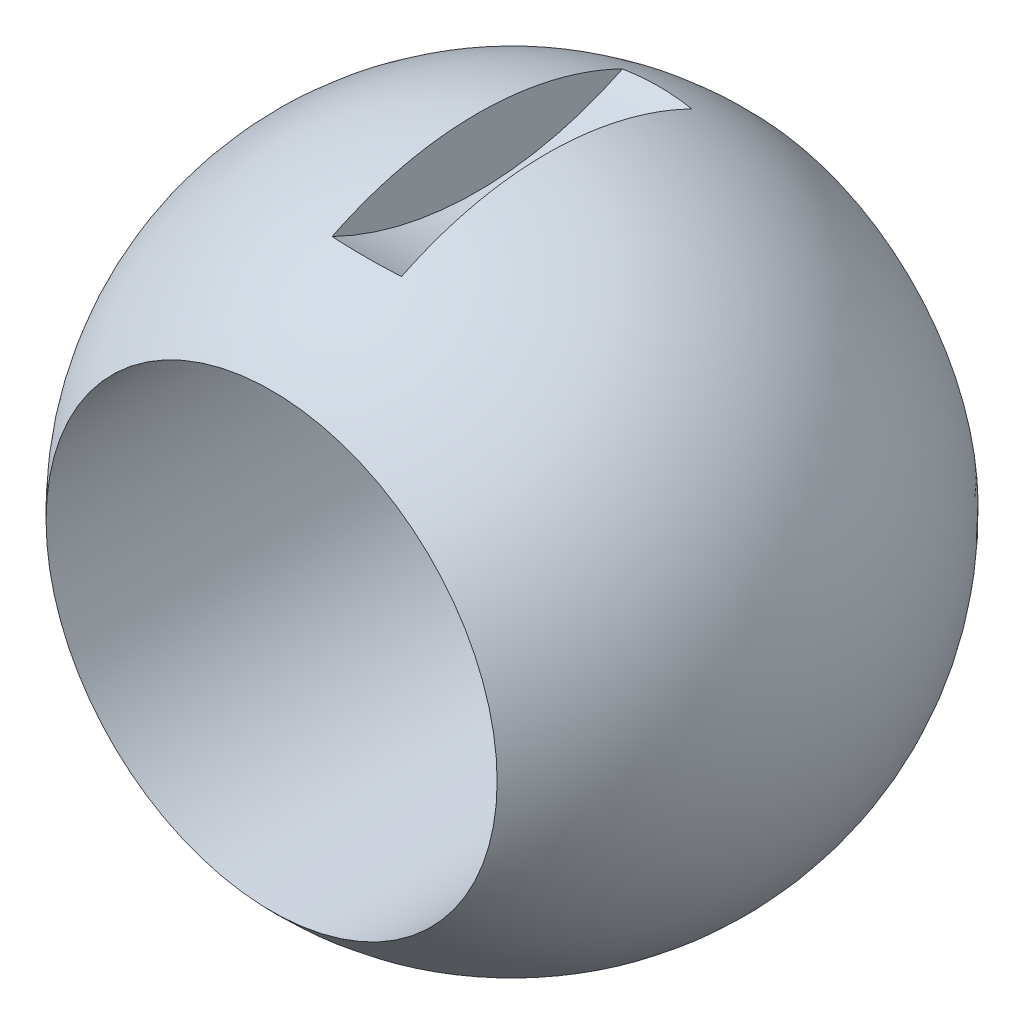
ISO-10303-21;
HEADER;
FILE_DESCRIPTION(('STEP AP214'),'2;1');
FILE_NAME('part.step','',(''),(''),'','','');
FILE_SCHEMA(('AUTOMOTIVE_DESIGN { 1 0 10303 214 1 1 1 1 }'));
ENDSEC;
DATA;
#1=APPLICATION_CONTEXT('core data for automotive mechanical design processes');
#2=APPLICATION_PROTOCOL_DEFINITION('international standard','automotive_design',2000,#1);
#3=PRODUCT_CONTEXT('',#1,'mechanical');
#4=PRODUCT('Part','Part','',(#3));
#5=PRODUCT_RELATED_PRODUCT_CATEGORY('part','',(#4));
#6=PRODUCT_DEFINITION_FORMATION('','',#4);
#7=PRODUCT_DEFINITION_CONTEXT('part definition',#1,'design');
#8=PRODUCT_DEFINITION('design','',#6,#7);
#9=PRODUCT_DEFINITION_SHAPE('','',#8);
#10=(LENGTH_UNIT() NAMED_UNIT(*) SI_UNIT(.MILLI.,.METRE.));
#11=(NAMED_UNIT(*) PLANE_ANGLE_UNIT() SI_UNIT($,.RADIAN.));
#12=(NAMED_UNIT(*) SI_UNIT($,.STERADIAN.) SOLID_ANGLE_UNIT());
#13=UNCERTAINTY_MEASURE_WITH_UNIT(LENGTH_MEASURE(1.E-05),#10,'distance_accuracy_value','');
#14=(GEOMETRIC_REPRESENTATION_CONTEXT(3) GLOBAL_UNCERTAINTY_ASSIGNED_CONTEXT((#13)) GLOBAL_UNIT_ASSIGNED_CONTEXT((#10,
#11,#12)) REPRESENTATION_CONTEXT('',''));
#15=CARTESIAN_POINT('',(0.,0.,0.));
#16=DIRECTION('',(0.,0.,1.));
#17=DIRECTION('',(1.,0.,0.));
#18=AXIS2_PLACEMENT_3D('',#15,#16,#17);
#19=CARTESIAN_POINT('',(0.,0.,0.));
#20=DIRECTION('',(0.,-1.,0.));
#21=DIRECTION('',(-1.,0.,0.));
#22=AXIS2_PLACEMENT_3D('',#19,#20,#21);
#23=SPHERICAL_SURFACE('',#22,19.);
#24=CARTESIAN_POINT('',(2.,0.,0.));
#25=DIRECTION('',(1.,0.,0.));
#26=DIRECTION('',(0.,0.,-1.));
#27=AXIS2_PLACEMENT_3D('',#24,#25,#26);
#28=CIRCLE('',#27,18.8944436276912);
#29=CARTESIAN_POINT('',(2.,16.9411764705882,8.36639347582861));
#30=VERTEX_POINT('',#29);
#31=CARTESIAN_POINT('',(2.,16.9411764705882,-8.36639347582861));
#32=VERTEX_POINT('',#31);
#33=EDGE_CURVE('E11',#30,#32,#28,.F.);
#34=ORIENTED_EDGE('',*,*,#33,.F.);
#35=CARTESIAN_POINT('',(2.0002,16.9411647052941,8.36636948670669));
#36=CARTESIAN_POINT('',(1.66806482124683,16.9607328287319,8.40617993270359));
#37=CARTESIAN_POINT('',(1.33445581251093,16.9754632712827,8.43595102666531));
#38=CARTESIAN_POINT('',(0.66722693143367,16.9950754977673,8.4754582951075));
#39=CARTESIAN_POINT('',(0.333613465716835,17.,8.48528137423856));
#40=CARTESIAN_POINT('',(-0.333613465716835,17.,8.48528137423856));
#41=CARTESIAN_POINT('',(-0.66722693143367,16.9950754977673,8.4754582951075));
#42=CARTESIAN_POINT('',(-1.33445581251093,16.9754632712827,8.43595102666532));
#43=CARTESIAN_POINT('',(-1.66806482124683,16.9607328287319,8.40617993270359));
#44=CARTESIAN_POINT('',(-2.0002,16.9411647052941,8.3663694867067));
#45=B_SPLINE_CURVE_WITH_KNOTS('',3,(#35,#36,#37,#38,#39,#40,#41,#42,#43,#44),.UNSPECIFIED.,.F.,
.F.,(4,2,2,2,4),(0.,1.00504359017581,2.00569917592344,3.00635476167108,4.01139835184689),.UNSPECIFIED.);
#46=CARTESIAN_POINT('',(-2.,16.9411764705882,8.36639347582861));
#47=VERTEX_POINT('',#46);
#48=EDGE_CURVE('E51',#30,#47,#45,.T.);
#49=ORIENTED_EDGE('',*,*,#48,.T.);
#50=CARTESIAN_POINT('',(-2.,0.,0.));
#51=DIRECTION('',(1.,0.,0.));
#52=DIRECTION('',(0.,0.,-1.));
#53=AXIS2_PLACEMENT_3D('',#50,#51,#52);
#54=CIRCLE('',#53,18.8944436276912);
#55=CARTESIAN_POINT('',(-2.,16.9411764705882,-8.36639347582861));
#56=VERTEX_POINT('',#55);
#57=EDGE_CURVE('E69',#47,#56,#54,.F.);
#58=ORIENTED_EDGE('',*,*,#57,.T.);
#59=CARTESIAN_POINT('',(-2.0002,16.9411647052941,-8.36636948670669));
#60=CARTESIAN_POINT('',(-1.66806482124683,16.9607328287319,-8.40617993270359));
#61=CARTESIAN_POINT('',(-1.33445581251093,16.9754632712827,-8.43595102666531));
#62=CARTESIAN_POINT('',(-0.66722693143367,16.9950754977673,-8.4754582951075));
#63=CARTESIAN_POINT('',(-0.333613465716835,17.,-8.48528137423856));
#64=CARTESIAN_POINT('',(0.333613465716835,17.,-8.48528137423856));
#65=CARTESIAN_POINT('',(0.66722693143367,16.9950754977673,-8.4754582951075));
#66=CARTESIAN_POINT('',(1.33445581251093,16.9754632712827,-8.43595102666532));
#67=CARTESIAN_POINT('',(1.66806482124683,16.9607328287319,-8.40617993270359));
#68=CARTESIAN_POINT('',(2.0002,16.9411647052941,-8.3663694867067));
#69=B_SPLINE_CURVE_WITH_KNOTS('',3,(#59,#60,#61,#62,#63,#64,#65,#66,#67,#68),.UNSPECIFIED.,.F.,
.F.,(4,2,2,2,4),(0.,1.00504359017581,2.00569917592344,3.00635476167108,4.01139835184689),.UNSPECIFIED.);
#70=EDGE_CURVE('E74',#56,#32,#69,.T.);
#71=ORIENTED_EDGE('',*,*,#70,.T.);
#72=EDGE_LOOP('',(#34,#49,#58,#71));
#73=FACE_BOUND('',#72,.T.);
#74=CARTESIAN_POINT('',(0.,0.,13.856406460551));
#75=DIRECTION('',(0.,0.,-1.));
#76=DIRECTION('',(-1.,0.,0.));
#77=AXIS2_PLACEMENT_3D('',#74,#75,#76);
#78=CIRCLE('',#77,13.);
#79=CARTESIAN_POINT('',(-13.,0.,13.856406460551));
#80=VERTEX_POINT('',#79);
#81=EDGE_CURVE('E75',#80,#80,#78,.F.);
#82=ORIENTED_EDGE('',*,*,#81,.F.);
#83=EDGE_LOOP('',(#82));
#84=FACE_BOUND('',#83,.T.);
#85=CARTESIAN_POINT('',(0.,0.,-13.856406460551));
#86=DIRECTION('',(0.,0.,1.));
#87=DIRECTION('',(1.,0.,0.));
#88=AXIS2_PLACEMENT_3D('',#85,#86,#87);
#89=CIRCLE('',#88,13.);
#90=CARTESIAN_POINT('',(13.,0.,-13.856406460551));
#91=VERTEX_POINT('',#90);
#92=EDGE_CURVE('E109',#91,#91,#89,.F.);
#93=ORIENTED_EDGE('',*,*,#92,.F.);
#94=EDGE_LOOP('',(#93));
#95=FACE_BOUND('',#94,.T.);
#96=ADVANCED_FACE('F43',(#73,#84,#95),#23,.T.);
#97=CARTESIAN_POINT('',(0.,0.,-19.));
#98=DIRECTION('',(0.,0.,1.));
#99=DIRECTION('',(1.,0.,0.));
#100=AXIS2_PLACEMENT_3D('',#97,#98,#99);
#101=CYLINDRICAL_SURFACE('',#100,13.);
#102=ORIENTED_EDGE('',*,*,#81,.T.);
#103=EDGE_LOOP('',(#102));
#104=FACE_BOUND('',#103,.T.);
#105=ORIENTED_EDGE('',*,*,#92,.T.);
#106=EDGE_LOOP('',(#105));
#107=FACE_BOUND('',#106,.T.);
#108=ADVANCED_FACE('F96',(#104,#107),#101,.F.);
#109=CARTESIAN_POINT('',(2.,34.,0.));
#110=DIRECTION('',(-1.,0.,0.));
#111=DIRECTION('',(0.,0.,1.));
#112=AXIS2_PLACEMENT_3D('',#109,#110,#111);
#113=CYLINDRICAL_SURFACE('',#112,19.);
#114=CARTESIAN_POINT('',(2.,34.,0.));
#115=DIRECTION('',(1.,0.,0.));
#116=DIRECTION('',(0.,0.,-1.));
#117=AXIS2_PLACEMENT_3D('',#114,#115,#116);
#118=CIRCLE('',#117,19.);
#119=EDGE_CURVE('E79',#30,#32,#118,.T.);
#120=ORIENTED_EDGE('',*,*,#119,.T.);
#121=ORIENTED_EDGE('',*,*,#70,.F.);
#122=CARTESIAN_POINT('',(-2.,34.,0.));
#123=DIRECTION('',(1.,0.,0.));
#124=DIRECTION('',(0.,0.,-1.));
#125=AXIS2_PLACEMENT_3D('',#122,#123,#124);
#126=CIRCLE('',#125,19.);
#127=EDGE_CURVE('E57',#47,#56,#126,.T.);
#128=ORIENTED_EDGE('',*,*,#127,.F.);
#129=ORIENTED_EDGE('',*,*,#48,.F.);
#130=EDGE_LOOP('',(#120,#121,#128,#129));
#131=FACE_BOUND('',#130,.T.);
#132=ADVANCED_FACE('F78',(#131),#113,.F.);
#133=CARTESIAN_POINT('',(2.,34.,0.));
#134=DIRECTION('',(1.,0.,0.));
#135=DIRECTION('',(0.,0.,-1.));
#136=AXIS2_PLACEMENT_3D('',#133,#134,#135);
#137=PLANE('',#136);
#138=ORIENTED_EDGE('',*,*,#33,.T.);
#139=ORIENTED_EDGE('',*,*,#119,.F.);
#140=EDGE_LOOP('',(#138,#139));
#141=FACE_BOUND('',#140,.T.);
#142=ADVANCED_FACE('F95',(#141),#137,.F.);
#143=CARTESIAN_POINT('',(-2.,34.,0.));
#144=DIRECTION('',(1.,0.,0.));
#145=DIRECTION('',(0.,0.,-1.));
#146=AXIS2_PLACEMENT_3D('',#143,#144,#145);
#147=PLANE('',#146);
#148=ORIENTED_EDGE('',*,*,#127,.T.);
#149=ORIENTED_EDGE('',*,*,#57,.F.);
#150=EDGE_LOOP('',(#148,#149));
#151=FACE_BOUND('',#150,.T.);
#152=ADVANCED_FACE('F70',(#151),#147,.T.);
#153=CLOSED_SHELL('',(#96,#108,#132,#142,#152));
#154=MANIFOLD_SOLID_BREP('B2',#153);
#155=ADVANCED_BREP_SHAPE_REPRESENTATION('',(#18,#154),#14);
#156=SHAPE_DEFINITION_REPRESENTATION(#9,#155);
ENDSEC;
END-ISO-10303-21;
